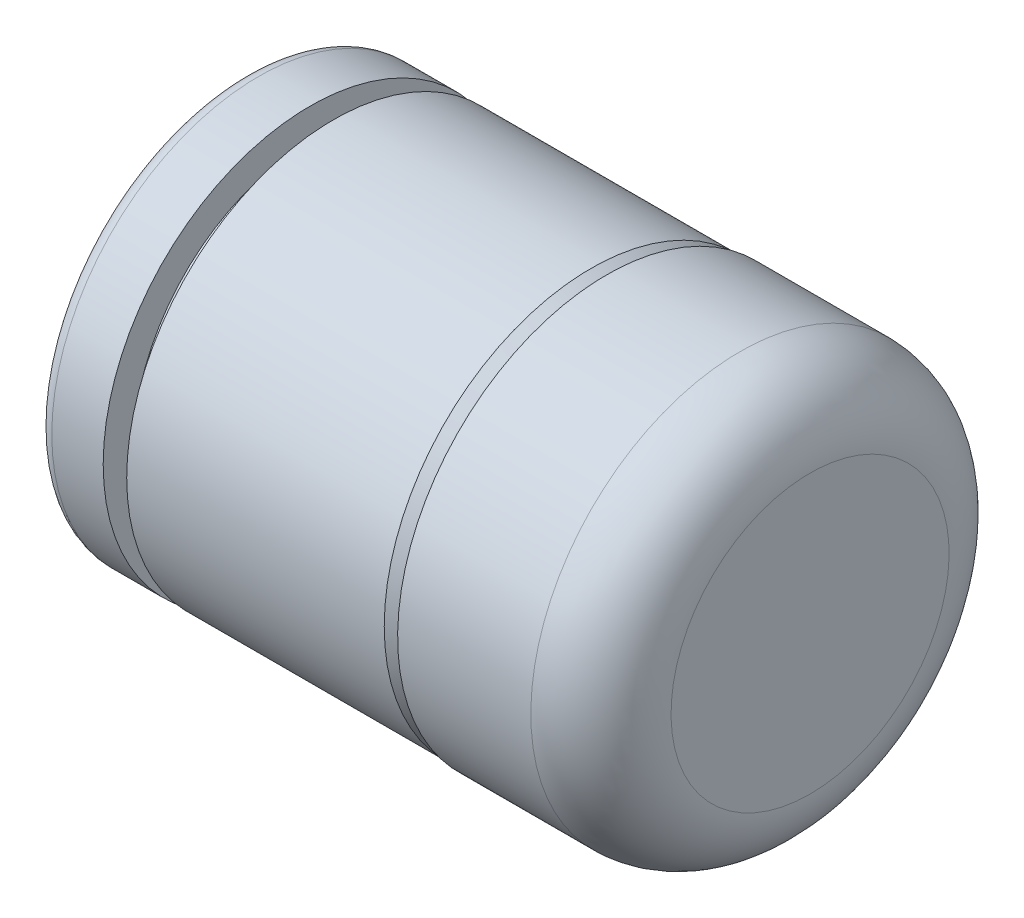
ISO-10303-21;
HEADER;
FILE_DESCRIPTION(('STEP AP214'),'2;1');
FILE_NAME('part.step','',(''),(''),'','','');
FILE_SCHEMA(('AUTOMOTIVE_DESIGN { 1 0 10303 214 1 1 1 1 }'));
ENDSEC;
DATA;
#1=APPLICATION_CONTEXT('core data for automotive mechanical design processes');
#2=APPLICATION_PROTOCOL_DEFINITION('international standard','automotive_design',2000,#1);
#3=PRODUCT_CONTEXT('',#1,'mechanical');
#4=PRODUCT('Part','Part','',(#3));
#5=PRODUCT_RELATED_PRODUCT_CATEGORY('part','',(#4));
#6=PRODUCT_DEFINITION_FORMATION('','',#4);
#7=PRODUCT_DEFINITION_CONTEXT('part definition',#1,'design');
#8=PRODUCT_DEFINITION('design','',#6,#7);
#9=PRODUCT_DEFINITION_SHAPE('','',#8);
#10=(LENGTH_UNIT() NAMED_UNIT(*) SI_UNIT(.MILLI.,.METRE.));
#11=(NAMED_UNIT(*) PLANE_ANGLE_UNIT() SI_UNIT($,.RADIAN.));
#12=(NAMED_UNIT(*) SI_UNIT($,.STERADIAN.) SOLID_ANGLE_UNIT());
#13=UNCERTAINTY_MEASURE_WITH_UNIT(LENGTH_MEASURE(1.E-05),#10,'distance_accuracy_value','');
#14=(GEOMETRIC_REPRESENTATION_CONTEXT(3) GLOBAL_UNCERTAINTY_ASSIGNED_CONTEXT((#13)) GLOBAL_UNIT_ASSIGNED_CONTEXT((#10,
#11,#12)) REPRESENTATION_CONTEXT('',''));
#15=CARTESIAN_POINT('',(0.,0.,0.));
#16=DIRECTION('',(0.,0.,1.));
#17=DIRECTION('',(1.,0.,0.));
#18=AXIS2_PLACEMENT_3D('',#15,#16,#17);
#19=CARTESIAN_POINT('',(292.,59.4999999999999,0.));
#20=DIRECTION('',(-1.,0.,0.));
#21=DIRECTION('',(0.,-1.,0.));
#22=AXIS2_PLACEMENT_3D('',#19,#20,#21);
#23=PLANE('',#22);
#24=CARTESIAN_POINT('',(292.,0.,0.));
#25=DIRECTION('',(-1.,0.,0.));
#26=DIRECTION('',(0.,-1.,0.));
#27=AXIS2_PLACEMENT_3D('',#24,#25,#26);
#28=CIRCLE('',#27,59.4999999999999);
#29=CARTESIAN_POINT('',(292.,-59.4999999999999,0.));
#30=VERTEX_POINT('',#29);
#31=EDGE_CURVE('E11',#30,#30,#28,.T.);
#32=ORIENTED_EDGE('',*,*,#31,.F.);
#33=EDGE_LOOP('',(#32));
#34=FACE_BOUND('',#33,.T.);
#35=ADVANCED_FACE('F48',(#34),#23,.F.);
#36=CARTESIAN_POINT('',(262.,0.,0.));
#37=DIRECTION('',(-1.,0.,0.));
#38=DIRECTION('',(0.,-1.,0.));
#39=AXIS2_PLACEMENT_3D('',#36,#37,#38);
#40=TOROIDAL_SURFACE('',#39,59.4999999999999,30.);
#41=CARTESIAN_POINT('',(262.,0.,0.));
#42=DIRECTION('',(-1.,0.,0.));
#43=DIRECTION('',(0.,-1.,0.));
#44=AXIS2_PLACEMENT_3D('',#41,#42,#43);
#45=CIRCLE('',#44,89.4999999999999);
#46=CARTESIAN_POINT('',(262.,-89.4999999999999,0.));
#47=VERTEX_POINT('',#46);
#48=EDGE_CURVE('E54',#47,#47,#45,.T.);
#49=ORIENTED_EDGE('',*,*,#48,.F.);
#50=EDGE_LOOP('',(#49));
#51=FACE_BOUND('',#50,.T.);
#52=ORIENTED_EDGE('',*,*,#31,.T.);
#53=EDGE_LOOP('',(#52));
#54=FACE_BOUND('',#53,.T.);
#55=ADVANCED_FACE('F96',(#51,#54),#40,.T.);
#56=CARTESIAN_POINT('',(290.,0.,0.));
#57=DIRECTION('',(-1.,0.,0.));
#58=DIRECTION('',(0.,-1.,0.));
#59=AXIS2_PLACEMENT_3D('',#56,#57,#58);
#60=CYLINDRICAL_SURFACE('',#59,89.4999999999999);
#61=CARTESIAN_POINT('',(205.,0.,0.));
#62=DIRECTION('',(-1.,0.,0.));
#63=DIRECTION('',(0.,-1.,0.));
#64=AXIS2_PLACEMENT_3D('',#61,#62,#63);
#65=CIRCLE('',#64,89.4999999999999);
#66=CARTESIAN_POINT('',(205.,-89.4999999999999,0.));
#67=VERTEX_POINT('',#66);
#68=EDGE_CURVE('E58',#67,#67,#65,.T.);
#69=ORIENTED_EDGE('',*,*,#68,.F.);
#70=EDGE_LOOP('',(#69));
#71=FACE_BOUND('',#70,.T.);
#72=ORIENTED_EDGE('',*,*,#48,.T.);
#73=EDGE_LOOP('',(#72));
#74=FACE_BOUND('',#73,.T.);
#75=ADVANCED_FACE('F91',(#71,#74),#60,.T.);
#76=CARTESIAN_POINT('',(205.,89.4999999999999,0.));
#77=DIRECTION('',(1.,0.,0.));
#78=DIRECTION('',(0.,1.,0.));
#79=AXIS2_PLACEMENT_3D('',#76,#77,#78);
#80=PLANE('',#79);
#81=CARTESIAN_POINT('',(205.,0.,0.));
#82=DIRECTION('',(-1.,0.,0.));
#83=DIRECTION('',(0.,-1.,0.));
#84=AXIS2_PLACEMENT_3D('',#81,#82,#83);
#85=CIRCLE('',#84,87.4999999999999);
#86=CARTESIAN_POINT('',(205.,-87.4999999999999,0.));
#87=VERTEX_POINT('',#86);
#88=EDGE_CURVE('E62',#87,#87,#85,.T.);
#89=ORIENTED_EDGE('',*,*,#88,.F.);
#90=EDGE_LOOP('',(#89));
#91=FACE_BOUND('',#90,.T.);
#92=ORIENTED_EDGE('',*,*,#68,.T.);
#93=EDGE_LOOP('',(#92));
#94=FACE_BOUND('',#93,.T.);
#95=ADVANCED_FACE('F85',(#91,#94),#80,.F.);
#96=CARTESIAN_POINT('',(290.,0.,0.));
#97=DIRECTION('',(-1.,0.,0.));
#98=DIRECTION('',(0.,-1.,0.));
#99=AXIS2_PLACEMENT_3D('',#96,#97,#98);
#100=CYLINDRICAL_SURFACE('',#99,87.4999999999999);
#101=CARTESIAN_POINT('',(262.,0.,0.));
#102=DIRECTION('',(-1.,0.,0.));
#103=DIRECTION('',(0.,-1.,0.));
#104=AXIS2_PLACEMENT_3D('',#101,#102,#103);
#105=CIRCLE('',#104,87.4999999999999);
#106=CARTESIAN_POINT('',(262.,-87.4999999999999,0.));
#107=VERTEX_POINT('',#106);
#108=EDGE_CURVE('E67',#107,#107,#105,.T.);
#109=ORIENTED_EDGE('',*,*,#108,.F.);
#110=EDGE_LOOP('',(#109));
#111=FACE_BOUND('',#110,.T.);
#112=ORIENTED_EDGE('',*,*,#88,.T.);
#113=EDGE_LOOP('',(#112));
#114=FACE_BOUND('',#113,.T.);
#115=ADVANCED_FACE('F79',(#111,#114),#100,.F.);
#116=CARTESIAN_POINT('',(262.,0.,0.));
#117=DIRECTION('',(-1.,0.,0.));
#118=DIRECTION('',(0.,-1.,0.));
#119=AXIS2_PLACEMENT_3D('',#116,#117,#118);
#120=TOROIDAL_SURFACE('',#119,59.4999999999999,28.);
#121=CARTESIAN_POINT('',(290.,0.,0.));
#122=DIRECTION('',(-1.,0.,0.));
#123=DIRECTION('',(0.,-1.,0.));
#124=AXIS2_PLACEMENT_3D('',#121,#122,#123);
#125=CIRCLE('',#124,59.4999999999999);
#126=CARTESIAN_POINT('',(290.,-59.4999999999999,0.));
#127=VERTEX_POINT('',#126);
#128=EDGE_CURVE('E70',#127,#127,#125,.T.);
#129=ORIENTED_EDGE('',*,*,#128,.F.);
#130=EDGE_LOOP('',(#129));
#131=FACE_BOUND('',#130,.T.);
#132=ORIENTED_EDGE('',*,*,#108,.T.);
#133=EDGE_LOOP('',(#132));
#134=FACE_BOUND('',#133,.T.);
#135=ADVANCED_FACE('F76',(#131,#134),#120,.F.);
#136=CARTESIAN_POINT('',(290.,59.4999999999999,0.));
#137=DIRECTION('',(1.,0.,0.));
#138=DIRECTION('',(0.,1.,0.));
#139=AXIS2_PLACEMENT_3D('',#136,#137,#138);
#140=PLANE('',#139);
#141=ORIENTED_EDGE('',*,*,#128,.T.);
#142=EDGE_LOOP('',(#141));
#143=FACE_BOUND('',#142,.T.);
#144=ADVANCED_FACE('F74',(#143),#140,.F.);
#145=CLOSED_SHELL('',(#35,#55,#75,#95,#115,#135,#144));
#146=MANIFOLD_SOLID_BREP('B2',#145);
#147=CARTESIAN_POINT('',(0.,0.,0.));
#148=DIRECTION('',(-1.,0.,0.));
#149=DIRECTION('',(0.,0.,1.));
#150=AXIS2_PLACEMENT_3D('',#147,#148,#149);
#151=CYLINDRICAL_SURFACE('',#150,9.5);
#152=DIRECTION('',(-1.,0.,0.));
#153=VECTOR('',#152,1.);
#154=CARTESIAN_POINT('',(0.,8.61684396980704,-4.));
#155=LINE('',#154,#153);
#156=CARTESIAN_POINT('',(1.00000000000008,8.61684396980704,-4.));
#157=VERTEX_POINT('',#156);
#158=CARTESIAN_POINT('',(15.,8.61684396980704,-4.));
#159=VERTEX_POINT('',#158);
#160=EDGE_CURVE('E240',#157,#159,#155,.F.);
#161=ORIENTED_EDGE('',*,*,#160,.T.);
#162=CARTESIAN_POINT('',(15.,8.61684396980704,-4.));
#163=CARTESIAN_POINT('',(15.1070733622197,8.6168202219102,-4.00001652171704));
#164=CARTESIAN_POINT('',(15.2141337582649,8.61883913420367,-3.99570121015309));
#165=CARTESIAN_POINT('',(15.4273782414771,8.62678458755757,-3.97853620702334));
#166=CARTESIAN_POINT('',(15.5335626798211,8.63270947704751,-3.9656901225209));
#167=CARTESIAN_POINT('',(15.7438380328309,8.64825555942463,-3.93166687755039));
#168=CARTESIAN_POINT('',(15.8479360488484,8.65786054910302,-3.91052622777028));
#169=CARTESIAN_POINT('',(16.0537611037534,8.68043383275915,-3.86015893776593));
#170=CARTESIAN_POINT('',(16.1554879750908,8.69340236363126,-3.83093172799522));
#171=CARTESIAN_POINT('',(16.4558380371579,8.7367265539777,-3.73160454499115));
#172=CARTESIAN_POINT('',(16.6500843971812,8.7715371289213,-3.64978438286234));
#173=CARTESIAN_POINT('',(17.0221983571607,8.84906615885084,-3.45755968169123));
#174=CARTESIAN_POINT('',(17.2000475136284,8.89179335974924,-3.34712347470033));
#175=CARTESIAN_POINT('',(17.5454606640458,8.98332238703905,-3.09339587448621));
#176=CARTESIAN_POINT('',(17.71185957173,9.03233168574719,-2.94858987992972));
#177=CARTESIAN_POINT('',(18.0188520427062,9.12919511090608,-2.63342986231558));
#178=CARTESIAN_POINT('',(18.1594393814567,9.17704895630556,-2.46306969473822));
#179=CARTESIAN_POINT('',(18.4169712416851,9.26879467184587,-2.09224800543283));
#180=CARTESIAN_POINT('',(18.5325696336795,9.31241191549435,-1.89077791501145));
#181=CARTESIAN_POINT('',(18.7276369987934,9.38813889113257,-1.46919231120501));
#182=CARTESIAN_POINT('',(18.8071496207802,9.42026251563906,-1.24909970793641));
#183=CARTESIAN_POINT('',(18.9108981164236,9.46274616203632,-0.856979269328659));
#184=CARTESIAN_POINT('',(18.9442042030842,9.47661969400504,-0.687699885516482));
#185=CARTESIAN_POINT('',(18.9776227767492,9.49059475490517,-0.43124612644251));
#186=CARTESIAN_POINT('',(18.9860056077377,9.49411397095223,-0.345273541887995));
#187=CARTESIAN_POINT('',(18.9971968820896,9.49881950450691,-0.17287509531496));
#188=CARTESIAN_POINT('',(19.0000035182926,9.50000506571115,-0.086449095446863));
#189=CARTESIAN_POINT('',(19.,9.5,0.));
#190=B_SPLINE_CURVE_WITH_KNOTS('',3,(#162,#163,#164,#165,#166,#167,#168,#169,#170,#171,#172,
#173,#174,#175,#176,#177,#178,#179,#180,#181,#182,#183,#184,#185,#186,#187,#188,#189),
.UNSPECIFIED.,.F.,.F.,(4,2,2,2,2,2,2,2,2,2,2,2,2,4),(0.,0.321092613763434,0.642049546435192,
0.961609273791227,1.28119151386781,1.91898963668567,2.55749661590881,3.23241938448552,
3.90750469965629,4.61292259093232,5.31748492896101,5.83503446588775,6.09419897683386,
6.35344746538502),.UNSPECIFIED.);
#191=CARTESIAN_POINT('',(19.,9.5,0.));
#192=VERTEX_POINT('',#191);
#193=EDGE_CURVE('E46',#159,#192,#190,.T.);
#194=ORIENTED_EDGE('',*,*,#193,.T.);
#195=CARTESIAN_POINT('',(19.,9.5,0.));
#196=CARTESIAN_POINT('',(19.0000155364417,9.50001673024081,0.107500293695405));
#197=CARTESIAN_POINT('',(18.9956667663075,9.49817573969564,0.214990124981542));
#198=CARTESIAN_POINT('',(18.9783612850177,9.49090331633228,0.429119072647007));
#199=CARTESIAN_POINT('',(18.9654073134706,9.48547302622982,0.53575844885136));
#200=CARTESIAN_POINT('',(18.931076117486,9.47117357809062,0.747031305029444));
#201=CARTESIAN_POINT('',(18.9097304968184,9.46231732454645,0.851670784016344));
#202=CARTESIAN_POINT('',(18.8588542415803,9.44141005495466,1.05858866530429));
#203=CARTESIAN_POINT('',(18.8293232419928,9.42935889643516,1.16086696209088));
#204=CARTESIAN_POINT('',(18.7288962465973,9.38886847152803,1.46295511442148));
#205=CARTESIAN_POINT('',(18.6461072917948,9.35606654459054,1.65837567154298));
#206=CARTESIAN_POINT('',(18.451610347173,9.28200191055812,2.03247849942221));
#207=CARTESIAN_POINT('',(18.3398788938614,9.24073234447435,2.21114702861594));
#208=CARTESIAN_POINT('',(18.084731346033,9.15153745518143,2.55587239107615));
#209=CARTESIAN_POINT('',(17.9400921714527,9.10339302527465,2.72096829259582));
#210=CARTESIAN_POINT('',(17.6258231247326,9.00680888160677,3.02538593873701));
#211=CARTESIAN_POINT('',(17.4561808594389,8.95836903289704,3.16469482394449));
#212=CARTESIAN_POINT('',(17.086253600478,8.86391016058751,3.42062313898511));
#213=CARTESIAN_POINT('',(16.8848466624855,8.81814081459859,3.53572194411247));
#214=CARTESIAN_POINT('',(16.4634792586586,8.73780649019031,3.72986226545602));
#215=CARTESIAN_POINT('',(16.2435473680821,8.70322463967079,3.8089581524652));
#216=CARTESIAN_POINT('',(15.8524924428132,8.65735611386798,3.91182987785272));
#217=CARTESIAN_POINT('',(15.6841951369562,8.64230267661773,3.94477080736435));
#218=CARTESIAN_POINT('',(15.4291355861606,8.6271033889127,3.97784143924458));
#219=CARTESIAN_POINT('',(15.3435916062938,8.62326697098912,3.9861416209821));
#220=CARTESIAN_POINT('',(15.1720397873928,8.61813308026054,3.99722385172175));
#221=CARTESIAN_POINT('',(15.0860317885503,8.61683654670134,4.00000385937614));
#222=CARTESIAN_POINT('',(15.,8.61684396980704,4.));
#223=B_SPLINE_CURVE_WITH_KNOTS('',3,(#195,#196,#197,#198,#199,#200,#201,#202,#203,#204,#205,
#206,#207,#208,#209,#210,#211,#212,#213,#214,#215,#216,#217,#218,#219,#220,#221,#222),
.UNSPECIFIED.,.F.,.F.,(4,2,2,2,2,2,2,2,2,2,2,2,2,4),(0.,0.322379641471474,0.644656697199349,
0.965731477587046,1.28682057821958,1.92792296928039,2.56954673333646,3.2407454794077,
3.91227804098609,4.61807914529997,5.32281079929864,5.83755657963996,6.09545575265978,
6.35345027845539),.UNSPECIFIED.);
#224=CARTESIAN_POINT('',(15.,8.61684396980704,4.));
#225=VERTEX_POINT('',#224);
#226=EDGE_CURVE('E172',#192,#225,#223,.T.);
#227=ORIENTED_EDGE('',*,*,#226,.T.);
#228=DIRECTION('',(-1.,0.,0.));
#229=VECTOR('',#228,1.);
#230=CARTESIAN_POINT('',(0.,8.61684396980704,4.));
#231=LINE('',#230,#229);
#232=CARTESIAN_POINT('',(1.00000000000008,8.61684396980704,4.));
#233=VERTEX_POINT('',#232);
#234=EDGE_CURVE('E237',#233,#225,#231,.F.);
#235=ORIENTED_EDGE('',*,*,#234,.F.);
#236=CARTESIAN_POINT('',(1.00000000000008,0.,0.));
#237=DIRECTION('',(-1.,0.,0.));
#238=DIRECTION('',(0.,0.,1.));
#239=AXIS2_PLACEMENT_3D('',#236,#237,#238);
#240=CIRCLE('',#239,9.5);
#241=EDGE_CURVE('E290',#233,#157,#240,.F.);
#242=ORIENTED_EDGE('',*,*,#241,.T.);
#243=EDGE_LOOP('',(#161,#194,#227,#235,#242));
#244=FACE_BOUND('',#243,.T.);
#245=CARTESIAN_POINT('',(40.,0.,0.));
#246=DIRECTION('',(-1.,0.,0.));
#247=DIRECTION('',(0.,0.,1.));
#248=AXIS2_PLACEMENT_3D('',#245,#246,#247);
#249=CIRCLE('',#248,9.5);
#250=CARTESIAN_POINT('',(40.,0.,9.5));
#251=VERTEX_POINT('',#250);
#252=EDGE_CURVE('E260',#251,#251,#249,.T.);
#253=ORIENTED_EDGE('',*,*,#252,.T.);
#254=EDGE_LOOP('',(#253));
#255=FACE_BOUND('',#254,.T.);
#256=ADVANCED_FACE('F162',(#244,#255),#151,.T.);
#257=CARTESIAN_POINT('',(0.,0.,0.));
#258=DIRECTION('',(-1.,0.,0.));
#259=DIRECTION('',(0.,0.,1.));
#260=AXIS2_PLACEMENT_3D('',#257,#258,#259);
#261=PLANE('',#260);
#262=DIRECTION('',(0.,0.,1.));
#263=VECTOR('',#262,1.);
#264=CARTESIAN_POINT('',(0.,6.,-4.));
#265=LINE('',#264,#263);
#266=CARTESIAN_POINT('',(0.,6.,-4.));
#267=VERTEX_POINT('',#266);
#268=CARTESIAN_POINT('',(0.,6.,4.));
#269=VERTEX_POINT('',#268);
#270=EDGE_CURVE('E229',#267,#269,#265,.T.);
#271=ORIENTED_EDGE('',*,*,#270,.F.);
#272=DIRECTION('',(0.,-1.,0.));
#273=VECTOR('',#272,1.);
#274=CARTESIAN_POINT('',(0.,9.5,-4.));
#275=LINE('',#274,#273);
#276=CARTESIAN_POINT('',(0.,7.49999999999995,-4.));
#277=VERTEX_POINT('',#276);
#278=EDGE_CURVE('E214',#277,#267,#275,.T.);
#279=ORIENTED_EDGE('',*,*,#278,.F.);
#280=CARTESIAN_POINT('',(0.,0.,0.));
#281=DIRECTION('',(-1.,0.,0.));
#282=DIRECTION('',(0.,0.,1.));
#283=AXIS2_PLACEMENT_3D('',#280,#281,#282);
#284=CIRCLE('',#283,8.49999999999995);
#285=CARTESIAN_POINT('',(0.,7.49999999999995,4.));
#286=VERTEX_POINT('',#285);
#287=EDGE_CURVE('E282',#277,#286,#284,.T.);
#288=ORIENTED_EDGE('',*,*,#287,.T.);
#289=DIRECTION('',(0.,-1.,0.));
#290=VECTOR('',#289,1.);
#291=CARTESIAN_POINT('',(0.,9.5,4.));
#292=LINE('',#291,#290);
#293=EDGE_CURVE('E236',#286,#269,#292,.T.);
#294=ORIENTED_EDGE('',*,*,#293,.T.);
#295=EDGE_LOOP('',(#271,#279,#288,#294));
#296=FACE_BOUND('',#295,.T.);
#297=ADVANCED_FACE('F235',(#296),#261,.T.);
#298=CARTESIAN_POINT('',(0.,0.,0.));
#299=DIRECTION('',(1.,0.,0.));
#300=DIRECTION('',(0.,0.,-1.));
#301=AXIS2_PLACEMENT_3D('',#298,#299,#300);
#302=CONICAL_SURFACE('',#301,8.49999999999995,0.785398163397432);
#303=ORIENTED_EDGE('',*,*,#287,.F.);
#304=CARTESIAN_POINT('',(-4.02840245565159,1.99879578712371,-4.));
#305=CARTESIAN_POINT('',(-3.99212108142957,2.07994939062361,-4.));
#306=CARTESIAN_POINT('',(-3.95438291483243,2.16043494747811,-4.));
#307=CARTESIAN_POINT('',(-3.87634863171485,2.32013242371134,-4.));
#308=CARTESIAN_POINT('',(-3.83605318470208,2.39934466969795,-4.));
#309=CARTESIAN_POINT('',(-3.71193273737313,2.63504134393546,-4.));
#310=CARTESIAN_POINT('',(-3.62478588511876,2.7897778937911,-4.));
#311=CARTESIAN_POINT('',(-3.44406472193908,3.09475509476895,-4.));
#312=CARTESIAN_POINT('',(-3.35051115284482,3.24500818561423,-4.));
#313=CARTESIAN_POINT('',(-3.15822995197834,3.54222344735515,-4.));
#314=CARTESIAN_POINT('',(-3.05950057658113,3.68918448511671,-4.));
#315=CARTESIAN_POINT('',(-2.85854195427889,3.9795691104299,-4.));
#316=CARTESIAN_POINT('',(-2.75633321156232,4.12300695575086,-4.));
#317=CARTESIAN_POINT('',(-2.5487729255823,4.40755823449876,-4.));
#318=CARTESIAN_POINT('',(-2.4434217427083,4.54867193161046,-4.));
#319=CARTESIAN_POINT('',(-2.23009085028011,4.82908322599227,-4.));
#320=CARTESIAN_POINT('',(-2.12210897891944,4.96837917453761,-4.));
#321=CARTESIAN_POINT('',(-1.90406979394118,5.24533891604717,-4.));
#322=CARTESIAN_POINT('',(-1.79401243323637,5.38300267186569,-4.));
#323=CARTESIAN_POINT('',(-1.53700030173134,5.70040250209493,-4.));
#324=CARTESIAN_POINT('',(-1.3894174921941,5.87962959144714,-4.));
#325=CARTESIAN_POINT('',(-1.09196044089366,6.23607867347316,-4.));
#326=CARTESIAN_POINT('',(-0.942086878470529,6.41330123448161,-4.));
#327=CARTESIAN_POINT('',(-0.64021350676176,6.76643553937924,-4.));
#328=CARTESIAN_POINT('',(-0.488210570811995,6.94234460718273,-4.));
#329=CARTESIAN_POINT('',(-0.182658954124428,7.29284074711029,-4.));
#330=CARTESIAN_POINT('',(-0.02911013810903,7.46742770115421,-4.));
#331=CARTESIAN_POINT('',(0.318362947205444,7.85962968937763,-4.));
#332=CARTESIAN_POINT('',(0.512648203578501,8.07692474011386,-4.));
#333=CARTESIAN_POINT('',(0.902805606802094,8.51008641446014,-4.));
#334=CARTESIAN_POINT('',(1.09867776556448,8.72595302732569,-4.));
#335=CARTESIAN_POINT('',(1.68821085758302,9.37180569756726,-4.));
#336=CARTESIAN_POINT('',(2.08378707457578,9.80004309212008,-4.));
#337=CARTESIAN_POINT('',(2.87665355120118,10.6513860583802,-4.));
#338=CARTESIAN_POINT('',(3.27392847407964,11.0745059549158,-4.));
#339=CARTESIAN_POINT('',(3.87168660888438,11.7074079562186,-4.));
#340=CARTESIAN_POINT('',(4.07123882018525,11.9180704804673,-4.));
#341=CARTESIAN_POINT('',(4.47088003893899,12.3388838999575,-4.));
#342=CARTESIAN_POINT('',(4.67096904382991,12.5490347976317,-4.));
#343=CARTESIAN_POINT('',(4.87128552842231,12.758968480351,-4.));
#344=B_SPLINE_CURVE_WITH_KNOTS('',3,(#304,#305,#306,#307,#308,#309,#310,#311,#312,#313,#314,
#315,#316,#317,#318,#319,#320,#321,#322,#323,#324,#325,#326,#327,#328,#329,#330,#331,#332,#333,
#334,#335,#336,#337,#338,#339,#340,#341,#342,#343),.UNSPECIFIED.,.F.,.F.,(4,2,2,2,2,2,2,2,2,2,2,
2,2,2,2,2,2,2,2,4),(0.,0.26664559836277,0.533221673397173,1.06574105049325,1.59661120510872,
2.12766136303837,2.65599293090054,3.18426413849331,3.71298516926359,4.24171820974524,
4.93820239485304,5.63448389256743,6.33192553192647,7.02942874320542,7.90387545515389,
8.77832873710238,10.5272413062885,12.2684127623799,13.1389279281733,14.0094389466336),.UNSPECIFIED.);
#345=EDGE_CURVE('E219',#277,#157,#344,.T.);
#346=ORIENTED_EDGE('',*,*,#345,.T.);
#347=ORIENTED_EDGE('',*,*,#241,.F.);
#348=CARTESIAN_POINT('',(-4.02840245565159,1.99879578712371,4.));
#349=CARTESIAN_POINT('',(-3.99212108142957,2.07994939062361,4.));
#350=CARTESIAN_POINT('',(-3.95438291483243,2.16043494747811,4.));
#351=CARTESIAN_POINT('',(-3.87634863171485,2.32013242371134,4.));
#352=CARTESIAN_POINT('',(-3.83605318470208,2.39934466969795,4.));
#353=CARTESIAN_POINT('',(-3.71193273737313,2.63504134393546,4.));
#354=CARTESIAN_POINT('',(-3.62478588511876,2.7897778937911,4.));
#355=CARTESIAN_POINT('',(-3.44406472193908,3.09475509476895,4.));
#356=CARTESIAN_POINT('',(-3.35051115284482,3.24500818561423,4.));
#357=CARTESIAN_POINT('',(-3.15822995197834,3.54222344735515,4.));
#358=CARTESIAN_POINT('',(-3.05950057658113,3.68918448511671,4.));
#359=CARTESIAN_POINT('',(-2.85854195427889,3.9795691104299,4.));
#360=CARTESIAN_POINT('',(-2.75633321156232,4.12300695575086,4.));
#361=CARTESIAN_POINT('',(-2.5487729255823,4.40755823449876,4.));
#362=CARTESIAN_POINT('',(-2.4434217427083,4.54867193161046,4.));
#363=CARTESIAN_POINT('',(-2.23009085028011,4.82908322599227,4.));
#364=CARTESIAN_POINT('',(-2.12210897891944,4.96837917453761,4.));
#365=CARTESIAN_POINT('',(-1.90406979394118,5.24533891604717,4.));
#366=CARTESIAN_POINT('',(-1.79401243323637,5.38300267186569,4.));
#367=CARTESIAN_POINT('',(-1.53700030173134,5.70040250209493,4.));
#368=CARTESIAN_POINT('',(-1.3894174921941,5.87962959144714,4.));
#369=CARTESIAN_POINT('',(-1.09196044089366,6.23607867347316,4.));
#370=CARTESIAN_POINT('',(-0.942086878470529,6.41330123448161,4.));
#371=CARTESIAN_POINT('',(-0.64021350676176,6.76643553937924,4.));
#372=CARTESIAN_POINT('',(-0.488210570811995,6.94234460718273,4.));
#373=CARTESIAN_POINT('',(-0.182658954124428,7.29284074711029,4.));
#374=CARTESIAN_POINT('',(-0.02911013810903,7.46742770115421,4.));
#375=CARTESIAN_POINT('',(0.318362947205444,7.85962968937763,4.));
#376=CARTESIAN_POINT('',(0.512648203578501,8.07692474011386,4.));
#377=CARTESIAN_POINT('',(0.902805606802094,8.51008641446014,4.));
#378=CARTESIAN_POINT('',(1.09867776556448,8.72595302732569,4.));
#379=CARTESIAN_POINT('',(1.68821085758302,9.37180569756726,4.));
#380=CARTESIAN_POINT('',(2.08378707457578,9.80004309212008,4.));
#381=CARTESIAN_POINT('',(2.87665355120118,10.6513860583802,4.));
#382=CARTESIAN_POINT('',(3.27392847407964,11.0745059549158,4.));
#383=CARTESIAN_POINT('',(3.87168660888438,11.7074079562186,4.));
#384=CARTESIAN_POINT('',(4.07123882018525,11.9180704804673,4.));
#385=CARTESIAN_POINT('',(4.47088003893899,12.3388838999575,4.));
#386=CARTESIAN_POINT('',(4.67096904382991,12.5490347976317,4.));
#387=CARTESIAN_POINT('',(4.87128552842231,12.758968480351,4.));
#388=B_SPLINE_CURVE_WITH_KNOTS('',3,(#348,#349,#350,#351,#352,#353,#354,#355,#356,#357,#358,
#359,#360,#361,#362,#363,#364,#365,#366,#367,#368,#369,#370,#371,#372,#373,#374,#375,#376,#377,
#378,#379,#380,#381,#382,#383,#384,#385,#386,#387),.UNSPECIFIED.,.F.,.F.,(4,2,2,2,2,2,2,2,2,2,2,
2,2,2,2,2,2,2,2,4),(0.,0.26664559836277,0.533221673397173,1.06574105049325,1.59661120510872,
2.12766136303837,2.65599293090054,3.18426413849331,3.71298516926359,4.24171820974524,
4.93820239485304,5.63448389256743,6.33192553192647,7.02942874320542,7.90387545515389,
8.77832873710238,10.5272413062885,12.2684127623799,13.1389279281733,14.0094389466336),.UNSPECIFIED.);
#389=EDGE_CURVE('E293',#286,#233,#388,.T.);
#390=ORIENTED_EDGE('',*,*,#389,.F.);
#391=EDGE_LOOP('',(#303,#346,#347,#390));
#392=FACE_BOUND('',#391,.T.);
#393=ADVANCED_FACE('F307',(#392),#302,.T.);
#394=CARTESIAN_POINT('',(0.,0.,0.));
#395=DIRECTION('',(-1.,0.,0.));
#396=DIRECTION('',(0.,0.,1.));
#397=AXIS2_PLACEMENT_3D('',#394,#395,#396);
#398=CYLINDRICAL_SURFACE('',#397,88.5);
#399=CARTESIAN_POINT('',(88.061999556015,0.,0.));
#400=DIRECTION('',(1.,0.,0.));
#401=DIRECTION('',(0.,0.,-1.));
#402=AXIS2_PLACEMENT_3D('',#399,#400,#401);
#403=CIRCLE('',#402,88.5);
#404=CARTESIAN_POINT('',(88.061999556015,0.,-88.5));
#405=VERTEX_POINT('',#404);
#406=EDGE_CURVE('E259',#405,#405,#403,.T.);
#407=ORIENTED_EDGE('',*,*,#406,.T.);
#408=EDGE_LOOP('',(#407));
#409=FACE_BOUND('',#408,.T.);
#410=CARTESIAN_POINT('',(198.267949192431,0.,0.));
#411=DIRECTION('',(-1.,0.,0.));
#412=DIRECTION('',(0.,0.,1.));
#413=AXIS2_PLACEMENT_3D('',#410,#411,#412);
#414=CIRCLE('',#413,88.5);
#415=CARTESIAN_POINT('',(198.267949192431,0.,88.5));
#416=VERTEX_POINT('',#415);
#417=EDGE_CURVE('E252',#416,#416,#414,.T.);
#418=ORIENTED_EDGE('',*,*,#417,.T.);
#419=EDGE_LOOP('',(#418));
#420=FACE_BOUND('',#419,.T.);
#421=ADVANCED_FACE('F410',(#409,#420),#398,.T.);
#422=CARTESIAN_POINT('',(56.,0.,0.));
#423=DIRECTION('',(-1.,0.,0.));
#424=DIRECTION('',(0.,0.,1.));
#425=AXIS2_PLACEMENT_3D('',#422,#423,#424);
#426=CIRCLE('',#425,88.5);
#427=CARTESIAN_POINT('',(56.,0.,88.5));
#428=VERTEX_POINT('',#427);
#429=EDGE_CURVE('E279',#428,#428,#426,.F.);
#430=ORIENTED_EDGE('',*,*,#429,.T.);
#431=EDGE_LOOP('',(#430));
#432=FACE_BOUND('',#431,.T.);
#433=CARTESIAN_POINT('',(78.,0.,0.));
#434=DIRECTION('',(1.,0.,0.));
#435=DIRECTION('',(0.,0.,-1.));
#436=AXIS2_PLACEMENT_3D('',#433,#434,#435);
#437=CIRCLE('',#436,88.5);
#438=CARTESIAN_POINT('',(78.,0.,-88.5));
#439=VERTEX_POINT('',#438);
#440=EDGE_CURVE('E264',#439,#439,#437,.F.);
#441=ORIENTED_EDGE('',*,*,#440,.T.);
#442=EDGE_LOOP('',(#441));
#443=FACE_BOUND('',#442,.T.);
#444=ADVANCED_FACE('F406',(#432,#443),#398,.T.);
#445=CARTESIAN_POINT('',(50.,0.,0.));
#446=DIRECTION('',(-1.,0.,0.));
#447=DIRECTION('',(0.,0.,1.));
#448=AXIS2_PLACEMENT_3D('',#445,#446,#447);
#449=PLANE('',#448);
#450=CARTESIAN_POINT('',(50.,0.,0.));
#451=DIRECTION('',(-1.,0.,0.));
#452=DIRECTION('',(0.,0.,1.));
#453=AXIS2_PLACEMENT_3D('',#450,#451,#452);
#454=CIRCLE('',#453,82.5);
#455=CARTESIAN_POINT('',(50.,0.,82.5));
#456=VERTEX_POINT('',#455);
#457=EDGE_CURVE('E276',#456,#456,#454,.T.);
#458=ORIENTED_EDGE('',*,*,#457,.T.);
#459=EDGE_LOOP('',(#458));
#460=FACE_BOUND('',#459,.T.);
#461=CARTESIAN_POINT('',(50.,0.,0.));
#462=DIRECTION('',(-1.,0.,0.));
#463=DIRECTION('',(0.,0.,1.));
#464=AXIS2_PLACEMENT_3D('',#461,#462,#463);
#465=CIRCLE('',#464,37.);
#466=CARTESIAN_POINT('',(50.,0.,37.));
#467=VERTEX_POINT('',#466);
#468=EDGE_CURVE('E273',#467,#467,#465,.T.);
#469=ORIENTED_EDGE('',*,*,#468,.F.);
#470=EDGE_LOOP('',(#469));
#471=FACE_BOUND('',#470,.T.);
#472=ADVANCED_FACE('F402',(#460,#471),#449,.T.);
#473=CARTESIAN_POINT('',(0.,0.,0.));
#474=DIRECTION('',(-1.,0.,0.));
#475=DIRECTION('',(0.,0.,1.));
#476=AXIS2_PLACEMENT_3D('',#473,#474,#475);
#477=CYLINDRICAL_SURFACE('',#476,37.);
#478=ORIENTED_EDGE('',*,*,#468,.T.);
#479=EDGE_LOOP('',(#478));
#480=FACE_BOUND('',#479,.T.);
#481=CARTESIAN_POINT('',(46.,0.,0.));
#482=DIRECTION('',(-1.,0.,0.));
#483=DIRECTION('',(0.,0.,1.));
#484=AXIS2_PLACEMENT_3D('',#481,#482,#483);
#485=CIRCLE('',#484,37.);
#486=CARTESIAN_POINT('',(46.,0.,37.));
#487=VERTEX_POINT('',#486);
#488=EDGE_CURVE('E270',#487,#487,#485,.T.);
#489=ORIENTED_EDGE('',*,*,#488,.F.);
#490=EDGE_LOOP('',(#489));
#491=FACE_BOUND('',#490,.T.);
#492=ADVANCED_FACE('F396',(#480,#491),#477,.T.);
#493=CARTESIAN_POINT('',(46.,0.,0.));
#494=DIRECTION('',(-1.,0.,0.));
#495=DIRECTION('',(0.,0.,1.));
#496=AXIS2_PLACEMENT_3D('',#493,#494,#495);
#497=PLANE('',#496);
#498=ORIENTED_EDGE('',*,*,#488,.T.);
#499=EDGE_LOOP('',(#498));
#500=FACE_BOUND('',#499,.T.);
#501=CARTESIAN_POINT('',(46.,0.,0.));
#502=DIRECTION('',(-1.,0.,0.));
#503=DIRECTION('',(0.,0.,1.));
#504=AXIS2_PLACEMENT_3D('',#501,#502,#503);
#505=CIRCLE('',#504,15.5);
#506=CARTESIAN_POINT('',(46.,0.,15.5));
#507=VERTEX_POINT('',#506);
#508=EDGE_CURVE('E267',#507,#507,#505,.T.);
#509=ORIENTED_EDGE('',*,*,#508,.F.);
#510=EDGE_LOOP('',(#509));
#511=FACE_BOUND('',#510,.T.);
#512=ADVANCED_FACE('F389',(#500,#511),#497,.T.);
#513=CARTESIAN_POINT('',(0.,0.,0.));
#514=DIRECTION('',(-1.,0.,0.));
#515=DIRECTION('',(0.,0.,1.));
#516=AXIS2_PLACEMENT_3D('',#513,#514,#515);
#517=CYLINDRICAL_SURFACE('',#516,15.5);
#518=ORIENTED_EDGE('',*,*,#508,.T.);
#519=EDGE_LOOP('',(#518));
#520=FACE_BOUND('',#519,.T.);
#521=CARTESIAN_POINT('',(40.,0.,0.));
#522=DIRECTION('',(-1.,0.,0.));
#523=DIRECTION('',(0.,0.,1.));
#524=AXIS2_PLACEMENT_3D('',#521,#522,#523);
#525=CIRCLE('',#524,15.5);
#526=CARTESIAN_POINT('',(40.,0.,15.5));
#527=VERTEX_POINT('',#526);
#528=EDGE_CURVE('E263',#527,#527,#525,.T.);
#529=ORIENTED_EDGE('',*,*,#528,.F.);
#530=EDGE_LOOP('',(#529));
#531=FACE_BOUND('',#530,.T.);
#532=ADVANCED_FACE('F382',(#520,#531),#517,.T.);
#533=CARTESIAN_POINT('',(40.,0.,0.));
#534=DIRECTION('',(-1.,0.,0.));
#535=DIRECTION('',(0.,0.,1.));
#536=AXIS2_PLACEMENT_3D('',#533,#534,#535);
#537=PLANE('',#536);
#538=ORIENTED_EDGE('',*,*,#528,.T.);
#539=EDGE_LOOP('',(#538));
#540=FACE_BOUND('',#539,.T.);
#541=ORIENTED_EDGE('',*,*,#252,.F.);
#542=EDGE_LOOP('',(#541));
#543=FACE_BOUND('',#542,.T.);
#544=ADVANCED_FACE('F345',(#540,#543),#537,.T.);
#545=CARTESIAN_POINT('',(56.,0.,0.));
#546=DIRECTION('',(-1.,0.,0.));
#547=DIRECTION('',(0.,0.,1.));
#548=AXIS2_PLACEMENT_3D('',#545,#546,#547);
#549=TOROIDAL_SURFACE('',#548,82.5,6.);
#550=ORIENTED_EDGE('',*,*,#429,.F.);
#551=EDGE_LOOP('',(#550));
#552=FACE_BOUND('',#551,.T.);
#553=ORIENTED_EDGE('',*,*,#457,.F.);
#554=EDGE_LOOP('',(#553));
#555=FACE_BOUND('',#554,.T.);
#556=ADVANCED_FACE('F338',(#552,#555),#549,.T.);
#557=CARTESIAN_POINT('',(78.,112.5,0.));
#558=DIRECTION('',(1.,0.,0.));
#559=DIRECTION('',(0.,0.,-1.));
#560=AXIS2_PLACEMENT_3D('',#557,#558,#559);
#561=PLANE('',#560);
#562=ORIENTED_EDGE('',*,*,#440,.F.);
#563=EDGE_LOOP('',(#562));
#564=FACE_BOUND('',#563,.T.);
#565=CARTESIAN_POINT('',(78.,0.,0.));
#566=DIRECTION('',(-1.,0.,0.));
#567=DIRECTION('',(0.,0.,1.));
#568=AXIS2_PLACEMENT_3D('',#565,#566,#567);
#569=CIRCLE('',#568,75.5);
#570=CARTESIAN_POINT('',(78.,0.,75.5));
#571=VERTEX_POINT('',#570);
#572=EDGE_CURVE('E256',#571,#571,#569,.T.);
#573=ORIENTED_EDGE('',*,*,#572,.T.);
#574=EDGE_LOOP('',(#573));
#575=FACE_BOUND('',#574,.T.);
#576=ADVANCED_FACE('F334',(#564,#575),#561,.T.);
#577=CARTESIAN_POINT('',(0.,0.,0.));
#578=DIRECTION('',(-1.,0.,0.));
#579=DIRECTION('',(0.,0.,1.));
#580=AXIS2_PLACEMENT_3D('',#577,#578,#579);
#581=CYLINDRICAL_SURFACE('',#580,75.5);
#582=CARTESIAN_POINT('',(82.,0.,0.));
#583=DIRECTION('',(-1.,0.,0.));
#584=DIRECTION('',(0.,0.,1.));
#585=AXIS2_PLACEMENT_3D('',#582,#583,#584);
#586=CIRCLE('',#585,75.5);
#587=CARTESIAN_POINT('',(82.,0.,75.5));
#588=VERTEX_POINT('',#587);
#589=EDGE_CURVE('E253',#588,#588,#586,.T.);
#590=ORIENTED_EDGE('',*,*,#589,.T.);
#591=EDGE_LOOP('',(#590));
#592=FACE_BOUND('',#591,.T.);
#593=ORIENTED_EDGE('',*,*,#572,.F.);
#594=EDGE_LOOP('',(#593));
#595=FACE_BOUND('',#594,.T.);
#596=ADVANCED_FACE('F330',(#592,#595),#581,.T.);
#597=CARTESIAN_POINT('',(82.,0.,0.));
#598=DIRECTION('',(1.,0.,0.));
#599=DIRECTION('',(0.,0.,-1.));
#600=AXIS2_PLACEMENT_3D('',#597,#598,#599);
#601=CONICAL_SURFACE('',#600,75.5,1.13446401379632);
#602=ORIENTED_EDGE('',*,*,#406,.F.);
#603=EDGE_LOOP('',(#602));
#604=FACE_BOUND('',#603,.T.);
#605=ORIENTED_EDGE('',*,*,#589,.F.);
#606=EDGE_LOOP('',(#605));
#607=FACE_BOUND('',#606,.T.);
#608=ADVANCED_FACE('F326',(#604,#607),#601,.T.);
#609=CARTESIAN_POINT('',(156.698729810778,0.,0.));
#610=DIRECTION('',(-1.,0.,0.));
#611=DIRECTION('',(0.,0.,1.));
#612=AXIS2_PLACEMENT_3D('',#609,#610,#611);
#613=CONICAL_SURFACE('',#612,112.5,0.523598775598297);
#614=ORIENTED_EDGE('',*,*,#417,.F.);
#615=EDGE_LOOP('',(#614));
#616=FACE_BOUND('',#615,.T.);
#617=CARTESIAN_POINT('',(220.784609690827,0.,0.));
#618=DIRECTION('',(-1.,0.,0.));
#619=DIRECTION('',(0.,0.,1.));
#620=AXIS2_PLACEMENT_3D('',#617,#618,#619);
#621=CIRCLE('',#620,75.4999999999999);
#622=CARTESIAN_POINT('',(220.784609690827,0.,75.4999999999999));
#623=VERTEX_POINT('',#622);
#624=EDGE_CURVE('E249',#623,#623,#621,.T.);
#625=ORIENTED_EDGE('',*,*,#624,.T.);
#626=EDGE_LOOP('',(#625));
#627=FACE_BOUND('',#626,.T.);
#628=ADVANCED_FACE('F322',(#616,#627),#613,.T.);
#629=CARTESIAN_POINT('',(0.,0.,0.));
#630=DIRECTION('',(-1.,0.,0.));
#631=DIRECTION('',(0.,0.,1.));
#632=AXIS2_PLACEMENT_3D('',#629,#630,#631);
#633=CYLINDRICAL_SURFACE('',#632,75.4999999999999);
#634=CARTESIAN_POINT('',(260.,0.,0.));
#635=DIRECTION('',(-1.,0.,0.));
#636=DIRECTION('',(0.,0.,1.));
#637=AXIS2_PLACEMENT_3D('',#634,#635,#636);
#638=CIRCLE('',#637,75.4999999999999);
#639=CARTESIAN_POINT('',(260.,0.,75.4999999999999));
#640=VERTEX_POINT('',#639);
#641=EDGE_CURVE('E246',#640,#640,#638,.T.);
#642=ORIENTED_EDGE('',*,*,#641,.T.);
#643=EDGE_LOOP('',(#642));
#644=FACE_BOUND('',#643,.T.);
#645=ORIENTED_EDGE('',*,*,#624,.F.);
#646=EDGE_LOOP('',(#645));
#647=FACE_BOUND('',#646,.T.);
#648=ADVANCED_FACE('F319',(#644,#647),#633,.T.);
#649=CARTESIAN_POINT('',(260.,0.,0.));
#650=DIRECTION('',(1.,0.,0.));
#651=DIRECTION('',(0.,0.,-1.));
#652=AXIS2_PLACEMENT_3D('',#649,#650,#651);
#653=PLANE('',#652);
#654=ORIENTED_EDGE('',*,*,#641,.F.);
#655=EDGE_LOOP('',(#654));
#656=FACE_BOUND('',#655,.T.);
#657=ADVANCED_FACE('F318',(#656),#653,.T.);
#658=CARTESIAN_POINT('',(0.,6.,-4.));
#659=DIRECTION('',(0.,-1.,0.));
#660=DIRECTION('',(0.,0.,-1.));
#661=AXIS2_PLACEMENT_3D('',#658,#659,#660);
#662=PLANE('',#661);
#663=DIRECTION('',(1.,0.,0.));
#664=VECTOR('',#663,1.);
#665=CARTESIAN_POINT('',(0.,6.,4.));
#666=LINE('',#665,#664);
#667=CARTESIAN_POINT('',(15.,6.,4.));
#668=VERTEX_POINT('',#667);
#669=EDGE_CURVE('E224',#269,#668,#666,.T.);
#670=ORIENTED_EDGE('',*,*,#669,.T.);
#671=CARTESIAN_POINT('',(15.,6.,0.));
#672=DIRECTION('',(0.,-1.,0.));
#673=DIRECTION('',(0.,0.,-1.));
#674=AXIS2_PLACEMENT_3D('',#671,#672,#673);
#675=CIRCLE('',#674,4.);
#676=CARTESIAN_POINT('',(19.,6.,0.));
#677=VERTEX_POINT('',#676);
#678=EDGE_CURVE('E369',#668,#677,#675,.F.);
#679=ORIENTED_EDGE('',*,*,#678,.T.);
#680=CARTESIAN_POINT('',(15.,6.,0.));
#681=DIRECTION('',(0.,-1.,0.));
#682=DIRECTION('',(0.,0.,-1.));
#683=AXIS2_PLACEMENT_3D('',#680,#681,#682);
#684=CIRCLE('',#683,4.);
#685=CARTESIAN_POINT('',(15.,6.,-4.));
#686=VERTEX_POINT('',#685);
#687=EDGE_CURVE('E232',#677,#686,#684,.F.);
#688=ORIENTED_EDGE('',*,*,#687,.T.);
#689=DIRECTION('',(1.,0.,0.));
#690=VECTOR('',#689,1.);
#691=CARTESIAN_POINT('',(0.,6.,-4.));
#692=LINE('',#691,#690);
#693=EDGE_CURVE('E217',#267,#686,#692,.T.);
#694=ORIENTED_EDGE('',*,*,#693,.F.);
#695=ORIENTED_EDGE('',*,*,#270,.T.);
#696=EDGE_LOOP('',(#670,#679,#688,#694,#695));
#697=FACE_BOUND('',#696,.T.);
#698=ADVANCED_FACE('F228',(#697),#662,.F.);
#699=CARTESIAN_POINT('',(0.,9.5,-4.));
#700=DIRECTION('',(0.,0.,1.));
#701=DIRECTION('',(1.,0.,0.));
#702=AXIS2_PLACEMENT_3D('',#699,#700,#701);
#703=PLANE('',#702);
#704=ORIENTED_EDGE('',*,*,#693,.T.);
#705=DIRECTION('',(0.,1.,0.));
#706=VECTOR('',#705,1.);
#707=CARTESIAN_POINT('',(15.,9.5,-4.));
#708=LINE('',#707,#706);
#709=EDGE_CURVE('E185',#686,#159,#708,.T.);
#710=ORIENTED_EDGE('',*,*,#709,.T.);
#711=ORIENTED_EDGE('',*,*,#160,.F.);
#712=ORIENTED_EDGE('',*,*,#345,.F.);
#713=ORIENTED_EDGE('',*,*,#278,.T.);
#714=EDGE_LOOP('',(#704,#710,#711,#712,#713));
#715=FACE_BOUND('',#714,.T.);
#716=ADVANCED_FACE('F216',(#715),#703,.T.);
#717=CARTESIAN_POINT('',(0.,9.5,4.));
#718=DIRECTION('',(0.,0.,1.));
#719=DIRECTION('',(1.,0.,0.));
#720=AXIS2_PLACEMENT_3D('',#717,#718,#719);
#721=PLANE('',#720);
#722=ORIENTED_EDGE('',*,*,#234,.T.);
#723=DIRECTION('',(0.,1.,0.));
#724=VECTOR('',#723,1.);
#725=CARTESIAN_POINT('',(15.,6.,4.));
#726=LINE('',#725,#724);
#727=EDGE_CURVE('E372',#225,#668,#726,.F.);
#728=ORIENTED_EDGE('',*,*,#727,.T.);
#729=ORIENTED_EDGE('',*,*,#669,.F.);
#730=ORIENTED_EDGE('',*,*,#293,.F.);
#731=ORIENTED_EDGE('',*,*,#389,.T.);
#732=EDGE_LOOP('',(#722,#728,#729,#730,#731));
#733=FACE_BOUND('',#732,.T.);
#734=ADVANCED_FACE('F310',(#733),#721,.F.);
#735=CARTESIAN_POINT('',(15.,9.5,0.));
#736=DIRECTION('',(0.,1.,0.));
#737=DIRECTION('',(0.,0.,1.));
#738=AXIS2_PLACEMENT_3D('',#735,#736,#737);
#739=CYLINDRICAL_SURFACE('',#738,4.);
#740=ORIENTED_EDGE('',*,*,#709,.F.);
#741=ORIENTED_EDGE('',*,*,#687,.F.);
#742=DIRECTION('',(0.,1.,0.));
#743=VECTOR('',#742,1.);
#744=CARTESIAN_POINT('',(19.,6.,0.));
#745=LINE('',#744,#743);
#746=EDGE_CURVE('E167',#192,#677,#745,.F.);
#747=ORIENTED_EDGE('',*,*,#746,.F.);
#748=ORIENTED_EDGE('',*,*,#193,.F.);
#749=EDGE_LOOP('',(#740,#741,#747,#748));
#750=FACE_BOUND('',#749,.T.);
#751=ADVANCED_FACE('F164',(#750),#739,.F.);
#752=CARTESIAN_POINT('',(15.,6.,0.));
#753=DIRECTION('',(0.,-1.,0.));
#754=DIRECTION('',(0.,0.,-1.));
#755=AXIS2_PLACEMENT_3D('',#752,#753,#754);
#756=CYLINDRICAL_SURFACE('',#755,4.);
#757=ORIENTED_EDGE('',*,*,#678,.F.);
#758=ORIENTED_EDGE('',*,*,#727,.F.);
#759=ORIENTED_EDGE('',*,*,#226,.F.);
#760=ORIENTED_EDGE('',*,*,#746,.T.);
#761=EDGE_LOOP('',(#757,#758,#759,#760));
#762=FACE_BOUND('',#761,.T.);
#763=ADVANCED_FACE('F359',(#762),#756,.F.);
#764=CLOSED_SHELL('',(#256,#297,#393,#421,#444,#472,#492,#512,#532,#544,#556,#576,#596,#608,
#628,#648,#657,#698,#716,#734,#751,#763));
#765=MANIFOLD_SOLID_BREP('B6',#764);
#766=ADVANCED_BREP_SHAPE_REPRESENTATION('',(#18,#146,#765),#14);
#767=SHAPE_DEFINITION_REPRESENTATION(#9,#766);
ENDSEC;
END-ISO-10303-21;
